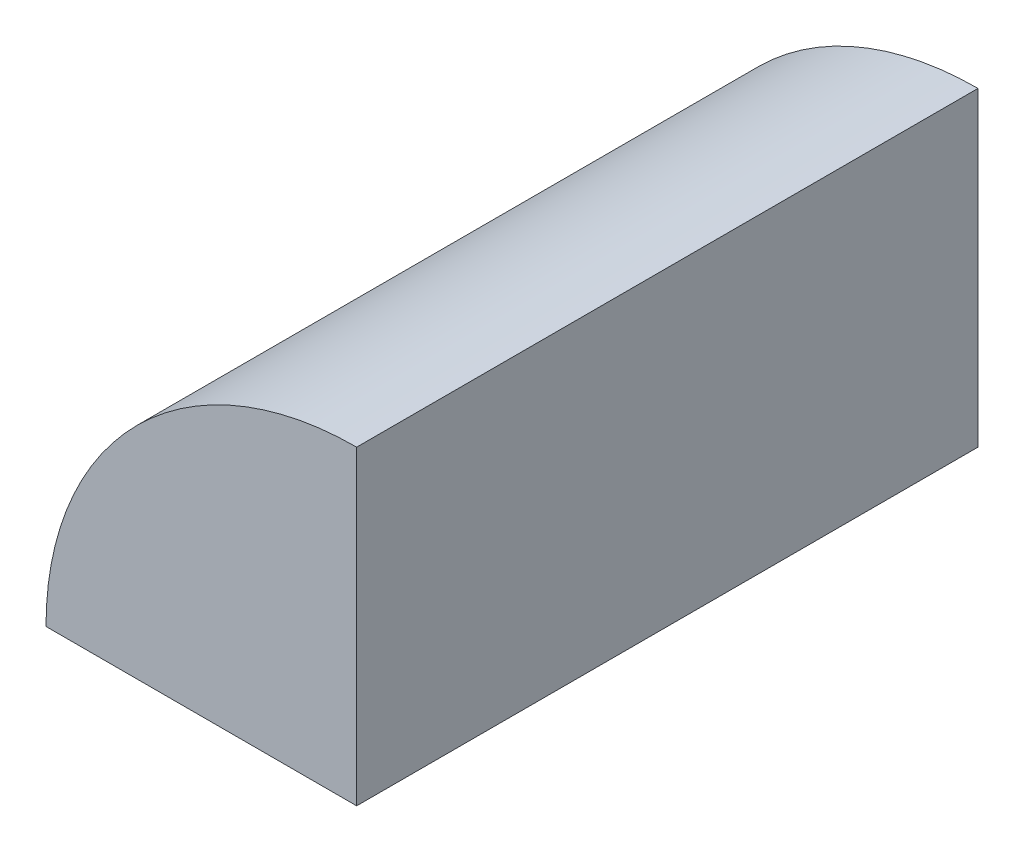
ISO-10303-21;
HEADER;
FILE_DESCRIPTION(('STEP AP214'),'2;1');
FILE_NAME('part.step','',(''),(''),'','','');
FILE_SCHEMA(('AUTOMOTIVE_DESIGN { 1 0 10303 214 1 1 1 1 }'));
ENDSEC;
DATA;
#1=APPLICATION_CONTEXT('core data for automotive mechanical design processes');
#2=APPLICATION_PROTOCOL_DEFINITION('international standard','automotive_design',2000,#1);
#3=PRODUCT_CONTEXT('',#1,'mechanical');
#4=PRODUCT('Part','Part','',(#3));
#5=PRODUCT_RELATED_PRODUCT_CATEGORY('part','',(#4));
#6=PRODUCT_DEFINITION_FORMATION('','',#4);
#7=PRODUCT_DEFINITION_CONTEXT('part definition',#1,'design');
#8=PRODUCT_DEFINITION('design','',#6,#7);
#9=PRODUCT_DEFINITION_SHAPE('','',#8);
#10=(LENGTH_UNIT() NAMED_UNIT(*) SI_UNIT(.MILLI.,.METRE.));
#11=(NAMED_UNIT(*) PLANE_ANGLE_UNIT() SI_UNIT($,.RADIAN.));
#12=(NAMED_UNIT(*) SI_UNIT($,.STERADIAN.) SOLID_ANGLE_UNIT());
#13=UNCERTAINTY_MEASURE_WITH_UNIT(LENGTH_MEASURE(1.E-05),#10,'distance_accuracy_value','');
#14=(GEOMETRIC_REPRESENTATION_CONTEXT(3) GLOBAL_UNCERTAINTY_ASSIGNED_CONTEXT((#13)) GLOBAL_UNIT_ASSIGNED_CONTEXT((#10,
#11,#12)) REPRESENTATION_CONTEXT('',''));
#15=CARTESIAN_POINT('',(0.,0.,0.));
#16=DIRECTION('',(0.,0.,1.));
#17=DIRECTION('',(1.,0.,0.));
#18=AXIS2_PLACEMENT_3D('',#15,#16,#17);
#19=CARTESIAN_POINT('',(-25.,0.,50.));
#20=DIRECTION('',(0.,1.,0.));
#21=DIRECTION('',(-1.,0.,0.));
#22=AXIS2_PLACEMENT_3D('',#19,#20,#21);
#23=PLANE('',#22);
#24=DIRECTION('',(1.,0.,0.));
#25=VECTOR('',#24,1.);
#26=CARTESIAN_POINT('',(-25.,0.,0.));
#27=LINE('',#26,#25);
#28=CARTESIAN_POINT('',(-25.,0.,0.));
#29=VERTEX_POINT('',#28);
#30=CARTESIAN_POINT('',(0.,0.,0.));
#31=VERTEX_POINT('',#30);
#32=EDGE_CURVE('E80',#29,#31,#27,.T.);
#33=ORIENTED_EDGE('',*,*,#32,.T.);
#34=DIRECTION('',(0.,0.,-1.));
#35=VECTOR('',#34,1.);
#36=CARTESIAN_POINT('',(0.,0.,50.));
#37=LINE('',#36,#35);
#38=CARTESIAN_POINT('',(0.,0.,50.));
#39=VERTEX_POINT('',#38);
#40=EDGE_CURVE('E11',#39,#31,#37,.T.);
#41=ORIENTED_EDGE('',*,*,#40,.F.);
#42=DIRECTION('',(1.,0.,0.));
#43=VECTOR('',#42,1.);
#44=CARTESIAN_POINT('',(-25.,0.,50.));
#45=LINE('',#44,#43);
#46=CARTESIAN_POINT('',(-25.,0.,50.));
#47=VERTEX_POINT('',#46);
#48=EDGE_CURVE('E73',#47,#39,#45,.T.);
#49=ORIENTED_EDGE('',*,*,#48,.F.);
#50=DIRECTION('',(0.,0.,-1.));
#51=VECTOR('',#50,1.);
#52=CARTESIAN_POINT('',(-25.,0.,50.));
#53=LINE('',#52,#51);
#54=EDGE_CURVE('E81',#47,#29,#53,.T.);
#55=ORIENTED_EDGE('',*,*,#54,.T.);
#56=EDGE_LOOP('',(#33,#41,#49,#55));
#57=FACE_BOUND('',#56,.T.);
#58=ADVANCED_FACE('F33',(#57),#23,.F.);
#59=CARTESIAN_POINT('',(0.,25.,50.));
#60=DIRECTION('',(-1.,0.,0.));
#61=DIRECTION('',(0.,0.,1.));
#62=AXIS2_PLACEMENT_3D('',#59,#60,#61);
#63=PLANE('',#62);
#64=DIRECTION('',(0.,1.,0.));
#65=VECTOR('',#64,1.);
#66=CARTESIAN_POINT('',(0.,25.,0.));
#67=LINE('',#66,#65);
#68=CARTESIAN_POINT('',(0.,25.,0.));
#69=VERTEX_POINT('',#68);
#70=EDGE_CURVE('E61',#31,#69,#67,.T.);
#71=ORIENTED_EDGE('',*,*,#70,.T.);
#72=DIRECTION('',(0.,0.,-1.));
#73=VECTOR('',#72,1.);
#74=CARTESIAN_POINT('',(0.,25.,50.));
#75=LINE('',#74,#73);
#76=CARTESIAN_POINT('',(0.,25.,50.));
#77=VERTEX_POINT('',#76);
#78=EDGE_CURVE('E41',#77,#69,#75,.T.);
#79=ORIENTED_EDGE('',*,*,#78,.F.);
#80=DIRECTION('',(0.,1.,0.));
#81=VECTOR('',#80,1.);
#82=CARTESIAN_POINT('',(0.,25.,50.));
#83=LINE('',#82,#81);
#84=EDGE_CURVE('E69',#39,#77,#83,.T.);
#85=ORIENTED_EDGE('',*,*,#84,.F.);
#86=ORIENTED_EDGE('',*,*,#40,.T.);
#87=EDGE_LOOP('',(#71,#79,#85,#86));
#88=FACE_BOUND('',#87,.T.);
#89=ADVANCED_FACE('F70',(#88),#63,.F.);
#90=CARTESIAN_POINT('',(0.,0.,50.));
#91=DIRECTION('',(0.,0.,-1.));
#92=DIRECTION('',(-1.,0.,0.));
#93=AXIS2_PLACEMENT_3D('',#90,#91,#92);
#94=CYLINDRICAL_SURFACE('',#93,25.);
#95=CARTESIAN_POINT('',(0.,0.,0.));
#96=DIRECTION('',(0.,0.,1.));
#97=DIRECTION('',(1.,0.,0.));
#98=AXIS2_PLACEMENT_3D('',#95,#96,#97);
#99=CIRCLE('',#98,25.);
#100=EDGE_CURVE('E66',#69,#29,#99,.T.);
#101=ORIENTED_EDGE('',*,*,#100,.T.);
#102=ORIENTED_EDGE('',*,*,#54,.F.);
#103=CARTESIAN_POINT('',(0.,0.,50.));
#104=DIRECTION('',(0.,0.,1.));
#105=DIRECTION('',(1.,0.,0.));
#106=AXIS2_PLACEMENT_3D('',#103,#104,#105);
#107=CIRCLE('',#106,25.);
#108=EDGE_CURVE('E49',#77,#47,#107,.T.);
#109=ORIENTED_EDGE('',*,*,#108,.F.);
#110=ORIENTED_EDGE('',*,*,#78,.T.);
#111=EDGE_LOOP('',(#101,#102,#109,#110));
#112=FACE_BOUND('',#111,.T.);
#113=ADVANCED_FACE('F92',(#112),#94,.T.);
#114=CARTESIAN_POINT('',(0.,0.,50.));
#115=DIRECTION('',(0.,0.,1.));
#116=DIRECTION('',(1.,0.,0.));
#117=AXIS2_PLACEMENT_3D('',#114,#115,#116);
#118=PLANE('',#117);
#119=ORIENTED_EDGE('',*,*,#48,.T.);
#120=ORIENTED_EDGE('',*,*,#84,.T.);
#121=ORIENTED_EDGE('',*,*,#108,.T.);
#122=EDGE_LOOP('',(#119,#120,#121));
#123=FACE_BOUND('',#122,.T.);
#124=ADVANCED_FACE('F76',(#123),#118,.T.);
#125=CARTESIAN_POINT('',(0.,0.,0.));
#126=DIRECTION('',(0.,0.,1.));
#127=DIRECTION('',(1.,0.,0.));
#128=AXIS2_PLACEMENT_3D('',#125,#126,#127);
#129=PLANE('',#128);
#130=CARTESIAN_POINT('',(-10.7881719816549,10.3887454440412,0.));
#131=DIRECTION('',(0.,0.,-1.));
#132=DIRECTION('',(-1.,0.,0.));
#133=AXIS2_PLACEMENT_3D('',#130,#131,#132);
#134=CIRCLE('',#133,5.);
#135=CARTESIAN_POINT('',(-15.7881719816549,10.3887454440412,0.));
#136=VERTEX_POINT('',#135);
#137=EDGE_CURVE('E87',#136,#136,#134,.T.);
#138=ORIENTED_EDGE('',*,*,#137,.F.);
#139=EDGE_LOOP('',(#138));
#140=FACE_BOUND('',#139,.T.);
#141=ORIENTED_EDGE('',*,*,#32,.F.);
#142=ORIENTED_EDGE('',*,*,#100,.F.);
#143=ORIENTED_EDGE('',*,*,#70,.F.);
#144=EDGE_LOOP('',(#141,#142,#143));
#145=FACE_BOUND('',#144,.T.);
#146=ADVANCED_FACE('F93',(#140,#145),#129,.F.);
#147=CARTESIAN_POINT('',(-10.7881719816549,10.3887454440412,10.));
#148=DIRECTION('',(0.,0.,-1.));
#149=DIRECTION('',(-1.,0.,0.));
#150=AXIS2_PLACEMENT_3D('',#147,#148,#149);
#151=CYLINDRICAL_SURFACE('',#150,5.);
#152=CARTESIAN_POINT('',(-10.7881719816549,10.3887454440412,10.));
#153=DIRECTION('',(0.,0.,-1.));
#154=DIRECTION('',(-1.,0.,0.));
#155=AXIS2_PLACEMENT_3D('',#152,#153,#154);
#156=CIRCLE('',#155,5.);
#157=CARTESIAN_POINT('',(-15.7881719816549,10.3887454440412,10.));
#158=VERTEX_POINT('',#157);
#159=EDGE_CURVE('E83',#158,#158,#156,.T.);
#160=ORIENTED_EDGE('',*,*,#159,.F.);
#161=EDGE_LOOP('',(#160));
#162=FACE_BOUND('',#161,.T.);
#163=ORIENTED_EDGE('',*,*,#137,.T.);
#164=EDGE_LOOP('',(#163));
#165=FACE_BOUND('',#164,.T.);
#166=ADVANCED_FACE('F95',(#162,#165),#151,.F.);
#167=CARTESIAN_POINT('',(-10.7881719816549,10.3887454440412,10.));
#168=DIRECTION('',(0.,0.,-1.));
#169=DIRECTION('',(-1.,0.,0.));
#170=AXIS2_PLACEMENT_3D('',#167,#168,#169);
#171=PLANE('',#170);
#172=ORIENTED_EDGE('',*,*,#159,.T.);
#173=EDGE_LOOP('',(#172));
#174=FACE_BOUND('',#173,.T.);
#175=ADVANCED_FACE('F102',(#174),#171,.T.);
#176=CLOSED_SHELL('',(#58,#89,#113,#124,#146,#166,#175));
#177=MANIFOLD_SOLID_BREP('B2',#176);
#178=ADVANCED_BREP_SHAPE_REPRESENTATION('',(#18,#177),#14);
#179=SHAPE_DEFINITION_REPRESENTATION(#9,#178);
ENDSEC;
END-ISO-10303-21;
